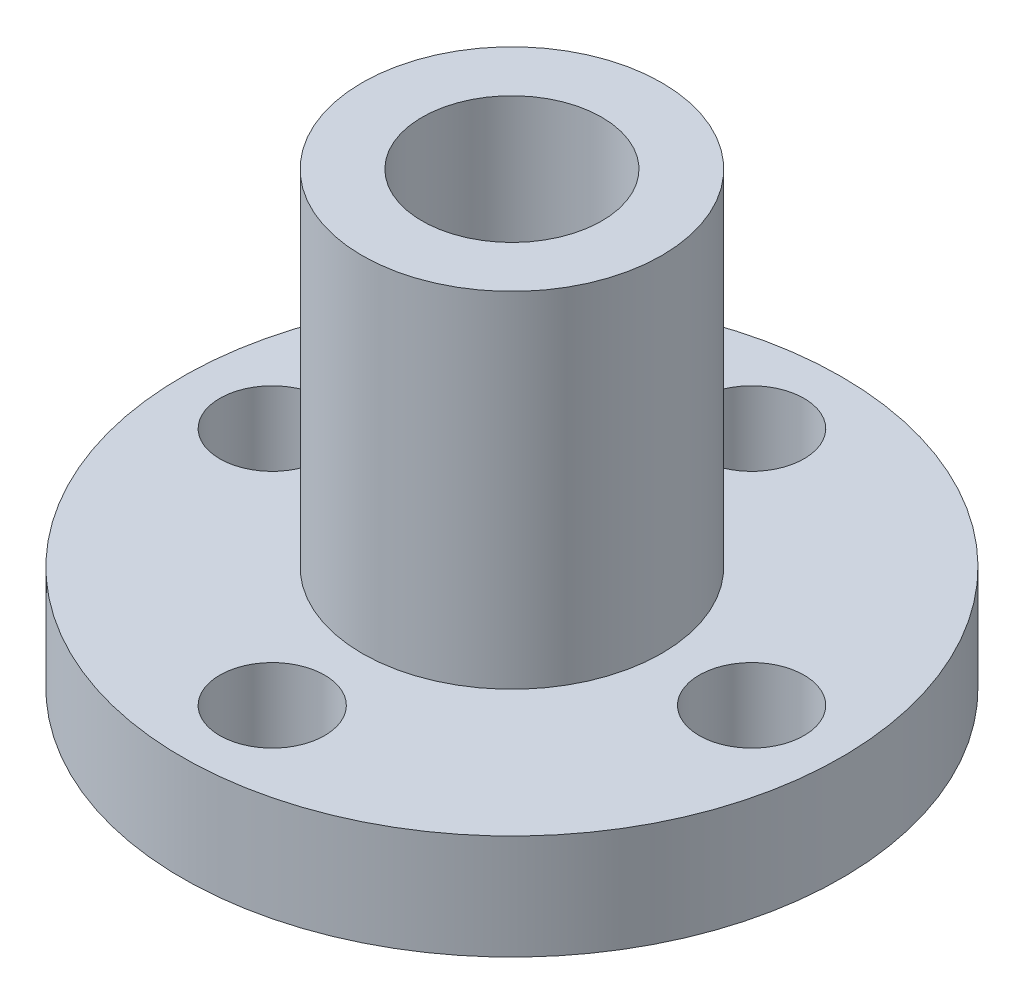
ISO-10303-21;
HEADER;
FILE_DESCRIPTION(('STEP AP214'),'2;1');
FILE_NAME('part.step','',(''),(''),'','','');
FILE_SCHEMA(('AUTOMOTIVE_DESIGN { 1 0 10303 214 1 1 1 1 }'));
ENDSEC;
DATA;
#1=APPLICATION_CONTEXT('core data for automotive mechanical design processes');
#2=APPLICATION_PROTOCOL_DEFINITION('international standard','automotive_design',2000,#1);
#3=PRODUCT_CONTEXT('',#1,'mechanical');
#4=PRODUCT('Part','Part','',(#3));
#5=PRODUCT_RELATED_PRODUCT_CATEGORY('part','',(#4));
#6=PRODUCT_DEFINITION_FORMATION('','',#4);
#7=PRODUCT_DEFINITION_CONTEXT('part definition',#1,'design');
#8=PRODUCT_DEFINITION('design','',#6,#7);
#9=PRODUCT_DEFINITION_SHAPE('','',#8);
#10=(LENGTH_UNIT() NAMED_UNIT(*) SI_UNIT(.MILLI.,.METRE.));
#11=(NAMED_UNIT(*) PLANE_ANGLE_UNIT() SI_UNIT($,.RADIAN.));
#12=(NAMED_UNIT(*) SI_UNIT($,.STERADIAN.) SOLID_ANGLE_UNIT());
#13=UNCERTAINTY_MEASURE_WITH_UNIT(LENGTH_MEASURE(1.E-05),#10,'distance_accuracy_value','');
#14=(GEOMETRIC_REPRESENTATION_CONTEXT(3) GLOBAL_UNCERTAINTY_ASSIGNED_CONTEXT((#13)) GLOBAL_UNIT_ASSIGNED_CONTEXT((#10,
#11,#12)) REPRESENTATION_CONTEXT('',''));
#15=CARTESIAN_POINT('',(0.,0.,0.));
#16=DIRECTION('',(0.,0.,1.));
#17=DIRECTION('',(1.,0.,0.));
#18=AXIS2_PLACEMENT_3D('',#15,#16,#17);
#19=CARTESIAN_POINT('',(-5.,3.5,0.));
#20=DIRECTION('',(0.,-1.,0.));
#21=DIRECTION('',(0.,0.,-1.));
#22=AXIS2_PLACEMENT_3D('',#19,#20,#21);
#23=PLANE('',#22);
#24=CARTESIAN_POINT('',(0.,3.5,-8.));
#25=DIRECTION('',(0.,1.,0.));
#26=DIRECTION('',(0.,0.,1.));
#27=AXIS2_PLACEMENT_3D('',#24,#25,#26);
#28=CIRCLE('',#27,1.75);
#29=CARTESIAN_POINT('',(0.,3.5,-6.25));
#30=VERTEX_POINT('',#29);
#31=EDGE_CURVE('E51',#30,#30,#28,.T.);
#32=ORIENTED_EDGE('',*,*,#31,.F.);
#33=EDGE_LOOP('',(#32));
#34=FACE_BOUND('',#33,.T.);
#35=CARTESIAN_POINT('',(8.,3.5,0.));
#36=DIRECTION('',(0.,1.,0.));
#37=DIRECTION('',(0.,0.,1.));
#38=AXIS2_PLACEMENT_3D('',#35,#36,#37);
#39=CIRCLE('',#38,1.75);
#40=CARTESIAN_POINT('',(8.,3.5,1.75));
#41=VERTEX_POINT('',#40);
#42=EDGE_CURVE('E123',#41,#41,#39,.T.);
#43=ORIENTED_EDGE('',*,*,#42,.F.);
#44=EDGE_LOOP('',(#43));
#45=FACE_BOUND('',#44,.T.);
#46=CARTESIAN_POINT('',(0.,3.5,8.));
#47=DIRECTION('',(0.,1.,0.));
#48=DIRECTION('',(0.,0.,1.));
#49=AXIS2_PLACEMENT_3D('',#46,#47,#48);
#50=CIRCLE('',#49,1.75);
#51=CARTESIAN_POINT('',(0.,3.5,9.75));
#52=VERTEX_POINT('',#51);
#53=EDGE_CURVE('E126',#52,#52,#50,.T.);
#54=ORIENTED_EDGE('',*,*,#53,.F.);
#55=EDGE_LOOP('',(#54));
#56=FACE_BOUND('',#55,.T.);
#57=CARTESIAN_POINT('',(-8.,3.5,0.));
#58=DIRECTION('',(0.,1.,0.));
#59=DIRECTION('',(0.,0.,1.));
#60=AXIS2_PLACEMENT_3D('',#57,#58,#59);
#61=CIRCLE('',#60,1.75);
#62=CARTESIAN_POINT('',(-8.,3.5,1.75));
#63=VERTEX_POINT('',#62);
#64=EDGE_CURVE('E70',#63,#63,#61,.T.);
#65=ORIENTED_EDGE('',*,*,#64,.F.);
#66=EDGE_LOOP('',(#65));
#67=FACE_BOUND('',#66,.T.);
#68=CARTESIAN_POINT('',(0.,3.5,0.));
#69=DIRECTION('',(0.,-1.,0.));
#70=DIRECTION('',(0.,0.,-1.));
#71=AXIS2_PLACEMENT_3D('',#68,#69,#70);
#72=CIRCLE('',#71,11.);
#73=CARTESIAN_POINT('',(0.,3.5,-11.));
#74=VERTEX_POINT('',#73);
#75=EDGE_CURVE('E10',#74,#74,#72,.T.);
#76=ORIENTED_EDGE('',*,*,#75,.F.);
#77=EDGE_LOOP('',(#76));
#78=FACE_BOUND('',#77,.T.);
#79=CARTESIAN_POINT('',(0.,3.5,0.));
#80=DIRECTION('',(0.,-1.,0.));
#81=DIRECTION('',(0.,0.,-1.));
#82=AXIS2_PLACEMENT_3D('',#79,#80,#81);
#83=CIRCLE('',#82,5.);
#84=CARTESIAN_POINT('',(0.,3.5,-5.));
#85=VERTEX_POINT('',#84);
#86=EDGE_CURVE('E58',#85,#85,#83,.T.);
#87=ORIENTED_EDGE('',*,*,#86,.T.);
#88=EDGE_LOOP('',(#87));
#89=FACE_BOUND('',#88,.T.);
#90=ADVANCED_FACE('F31',(#34,#45,#56,#67,#78,#89),#23,.F.);
#91=CARTESIAN_POINT('',(0.,0.,0.));
#92=DIRECTION('',(0.,-1.,0.));
#93=DIRECTION('',(0.,0.,-1.));
#94=AXIS2_PLACEMENT_3D('',#91,#92,#93);
#95=CYLINDRICAL_SURFACE('',#94,11.);
#96=CARTESIAN_POINT('',(0.,0.,0.));
#97=DIRECTION('',(0.,-1.,0.));
#98=DIRECTION('',(0.,0.,-1.));
#99=AXIS2_PLACEMENT_3D('',#96,#97,#98);
#100=CIRCLE('',#99,11.);
#101=CARTESIAN_POINT('',(0.,0.,-11.));
#102=VERTEX_POINT('',#101);
#103=EDGE_CURVE('E38',#102,#102,#100,.T.);
#104=ORIENTED_EDGE('',*,*,#103,.F.);
#105=EDGE_LOOP('',(#104));
#106=FACE_BOUND('',#105,.T.);
#107=ORIENTED_EDGE('',*,*,#75,.T.);
#108=EDGE_LOOP('',(#107));
#109=FACE_BOUND('',#108,.T.);
#110=ADVANCED_FACE('F82',(#106,#109),#95,.T.);
#111=CARTESIAN_POINT('',(-11.,0.,0.));
#112=DIRECTION('',(0.,1.,0.));
#113=DIRECTION('',(0.,0.,1.));
#114=AXIS2_PLACEMENT_3D('',#111,#112,#113);
#115=PLANE('',#114);
#116=CARTESIAN_POINT('',(0.,0.,-8.));
#117=DIRECTION('',(0.,1.,0.));
#118=DIRECTION('',(0.,0.,1.));
#119=AXIS2_PLACEMENT_3D('',#116,#117,#118);
#120=CIRCLE('',#119,1.75);
#121=CARTESIAN_POINT('',(0.,0.,-6.25));
#122=VERTEX_POINT('',#121);
#123=EDGE_CURVE('E34',#122,#122,#120,.T.);
#124=ORIENTED_EDGE('',*,*,#123,.T.);
#125=EDGE_LOOP('',(#124));
#126=FACE_BOUND('',#125,.T.);
#127=CARTESIAN_POINT('',(8.,0.,0.));
#128=DIRECTION('',(0.,1.,0.));
#129=DIRECTION('',(0.,0.,1.));
#130=AXIS2_PLACEMENT_3D('',#127,#128,#129);
#131=CIRCLE('',#130,1.75);
#132=CARTESIAN_POINT('',(8.,0.,1.75));
#133=VERTEX_POINT('',#132);
#134=EDGE_CURVE('E53',#133,#133,#131,.T.);
#135=ORIENTED_EDGE('',*,*,#134,.T.);
#136=EDGE_LOOP('',(#135));
#137=FACE_BOUND('',#136,.T.);
#138=CARTESIAN_POINT('',(0.,0.,8.));
#139=DIRECTION('',(0.,1.,0.));
#140=DIRECTION('',(0.,0.,1.));
#141=AXIS2_PLACEMENT_3D('',#138,#139,#140);
#142=CIRCLE('',#141,1.75);
#143=CARTESIAN_POINT('',(0.,0.,9.75));
#144=VERTEX_POINT('',#143);
#145=EDGE_CURVE('E50',#144,#144,#142,.T.);
#146=ORIENTED_EDGE('',*,*,#145,.T.);
#147=EDGE_LOOP('',(#146));
#148=FACE_BOUND('',#147,.T.);
#149=CARTESIAN_POINT('',(-8.,0.,0.));
#150=DIRECTION('',(0.,1.,0.));
#151=DIRECTION('',(0.,0.,1.));
#152=AXIS2_PLACEMENT_3D('',#149,#150,#151);
#153=CIRCLE('',#152,1.75);
#154=CARTESIAN_POINT('',(-8.,0.,1.75));
#155=VERTEX_POINT('',#154);
#156=EDGE_CURVE('E47',#155,#155,#153,.T.);
#157=ORIENTED_EDGE('',*,*,#156,.T.);
#158=EDGE_LOOP('',(#157));
#159=FACE_BOUND('',#158,.T.);
#160=CARTESIAN_POINT('',(0.,0.,0.));
#161=DIRECTION('',(0.,-1.,0.));
#162=DIRECTION('',(0.,0.,-1.));
#163=AXIS2_PLACEMENT_3D('',#160,#161,#162);
#164=CIRCLE('',#163,3.);
#165=CARTESIAN_POINT('',(0.,0.,-3.));
#166=VERTEX_POINT('',#165);
#167=EDGE_CURVE('E43',#166,#166,#164,.T.);
#168=ORIENTED_EDGE('',*,*,#167,.F.);
#169=EDGE_LOOP('',(#168));
#170=FACE_BOUND('',#169,.T.);
#171=ORIENTED_EDGE('',*,*,#103,.T.);
#172=EDGE_LOOP('',(#171));
#173=FACE_BOUND('',#172,.T.);
#174=ADVANCED_FACE('F79',(#126,#137,#148,#159,#170,#173),#115,.F.);
#175=CARTESIAN_POINT('',(0.,0.,0.));
#176=DIRECTION('',(0.,-1.,0.));
#177=DIRECTION('',(0.,0.,-1.));
#178=AXIS2_PLACEMENT_3D('',#175,#176,#177);
#179=CYLINDRICAL_SURFACE('',#178,3.);
#180=CARTESIAN_POINT('',(0.,15.,0.));
#181=DIRECTION('',(0.,-1.,0.));
#182=DIRECTION('',(0.,0.,-1.));
#183=AXIS2_PLACEMENT_3D('',#180,#181,#182);
#184=CIRCLE('',#183,3.);
#185=CARTESIAN_POINT('',(0.,15.,-3.));
#186=VERTEX_POINT('',#185);
#187=EDGE_CURVE('E67',#186,#186,#184,.T.);
#188=ORIENTED_EDGE('',*,*,#187,.F.);
#189=EDGE_LOOP('',(#188));
#190=FACE_BOUND('',#189,.T.);
#191=ORIENTED_EDGE('',*,*,#167,.T.);
#192=EDGE_LOOP('',(#191));
#193=FACE_BOUND('',#192,.T.);
#194=ADVANCED_FACE('F77',(#190,#193),#179,.F.);
#195=CARTESIAN_POINT('',(-3.,15.,0.));
#196=DIRECTION('',(0.,-1.,0.));
#197=DIRECTION('',(0.,0.,-1.));
#198=AXIS2_PLACEMENT_3D('',#195,#196,#197);
#199=PLANE('',#198);
#200=CARTESIAN_POINT('',(0.,15.,0.));
#201=DIRECTION('',(0.,-1.,0.));
#202=DIRECTION('',(0.,0.,-1.));
#203=AXIS2_PLACEMENT_3D('',#200,#201,#202);
#204=CIRCLE('',#203,5.);
#205=CARTESIAN_POINT('',(0.,15.,-5.));
#206=VERTEX_POINT('',#205);
#207=EDGE_CURVE('E62',#206,#206,#204,.T.);
#208=ORIENTED_EDGE('',*,*,#207,.F.);
#209=EDGE_LOOP('',(#208));
#210=FACE_BOUND('',#209,.T.);
#211=ORIENTED_EDGE('',*,*,#187,.T.);
#212=EDGE_LOOP('',(#211));
#213=FACE_BOUND('',#212,.T.);
#214=ADVANCED_FACE('F94',(#210,#213),#199,.F.);
#215=CARTESIAN_POINT('',(0.,0.,0.));
#216=DIRECTION('',(0.,-1.,0.));
#217=DIRECTION('',(0.,0.,-1.));
#218=AXIS2_PLACEMENT_3D('',#215,#216,#217);
#219=CYLINDRICAL_SURFACE('',#218,5.);
#220=ORIENTED_EDGE('',*,*,#86,.F.);
#221=EDGE_LOOP('',(#220));
#222=FACE_BOUND('',#221,.T.);
#223=ORIENTED_EDGE('',*,*,#207,.T.);
#224=EDGE_LOOP('',(#223));
#225=FACE_BOUND('',#224,.T.);
#226=ADVANCED_FACE('F98',(#222,#225),#219,.T.);
#227=CARTESIAN_POINT('',(-8.,-6.5,0.));
#228=DIRECTION('',(0.,1.,0.));
#229=DIRECTION('',(0.,0.,1.));
#230=AXIS2_PLACEMENT_3D('',#227,#228,#229);
#231=CYLINDRICAL_SURFACE('',#230,1.75);
#232=ORIENTED_EDGE('',*,*,#64,.T.);
#233=EDGE_LOOP('',(#232));
#234=FACE_BOUND('',#233,.T.);
#235=ORIENTED_EDGE('',*,*,#156,.F.);
#236=EDGE_LOOP('',(#235));
#237=FACE_BOUND('',#236,.T.);
#238=ADVANCED_FACE('F102',(#234,#237),#231,.F.);
#239=CARTESIAN_POINT('',(0.,-6.5,8.));
#240=DIRECTION('',(0.,1.,0.));
#241=DIRECTION('',(0.,0.,1.));
#242=AXIS2_PLACEMENT_3D('',#239,#240,#241);
#243=CYLINDRICAL_SURFACE('',#242,1.75);
#244=ORIENTED_EDGE('',*,*,#53,.T.);
#245=EDGE_LOOP('',(#244));
#246=FACE_BOUND('',#245,.T.);
#247=ORIENTED_EDGE('',*,*,#145,.F.);
#248=EDGE_LOOP('',(#247));
#249=FACE_BOUND('',#248,.T.);
#250=ADVANCED_FACE('F106',(#246,#249),#243,.F.);
#251=CARTESIAN_POINT('',(8.,-6.5,0.));
#252=DIRECTION('',(0.,1.,0.));
#253=DIRECTION('',(0.,0.,1.));
#254=AXIS2_PLACEMENT_3D('',#251,#252,#253);
#255=CYLINDRICAL_SURFACE('',#254,1.75);
#256=ORIENTED_EDGE('',*,*,#42,.T.);
#257=EDGE_LOOP('',(#256));
#258=FACE_BOUND('',#257,.T.);
#259=ORIENTED_EDGE('',*,*,#134,.F.);
#260=EDGE_LOOP('',(#259));
#261=FACE_BOUND('',#260,.T.);
#262=ADVANCED_FACE('F110',(#258,#261),#255,.F.);
#263=CARTESIAN_POINT('',(0.,-6.5,-8.));
#264=DIRECTION('',(0.,1.,0.));
#265=DIRECTION('',(0.,0.,1.));
#266=AXIS2_PLACEMENT_3D('',#263,#264,#265);
#267=CYLINDRICAL_SURFACE('',#266,1.75);
#268=ORIENTED_EDGE('',*,*,#31,.T.);
#269=EDGE_LOOP('',(#268));
#270=FACE_BOUND('',#269,.T.);
#271=ORIENTED_EDGE('',*,*,#123,.F.);
#272=EDGE_LOOP('',(#271));
#273=FACE_BOUND('',#272,.T.);
#274=ADVANCED_FACE('F114',(#270,#273),#267,.F.);
#275=CLOSED_SHELL('',(#90,#110,#174,#194,#214,#226,#238,#250,#262,#274));
#276=MANIFOLD_SOLID_BREP('B2',#275);
#277=ADVANCED_BREP_SHAPE_REPRESENTATION('',(#18,#276),#14);
#278=SHAPE_DEFINITION_REPRESENTATION(#9,#277);
ENDSEC;
END-ISO-10303-21;
